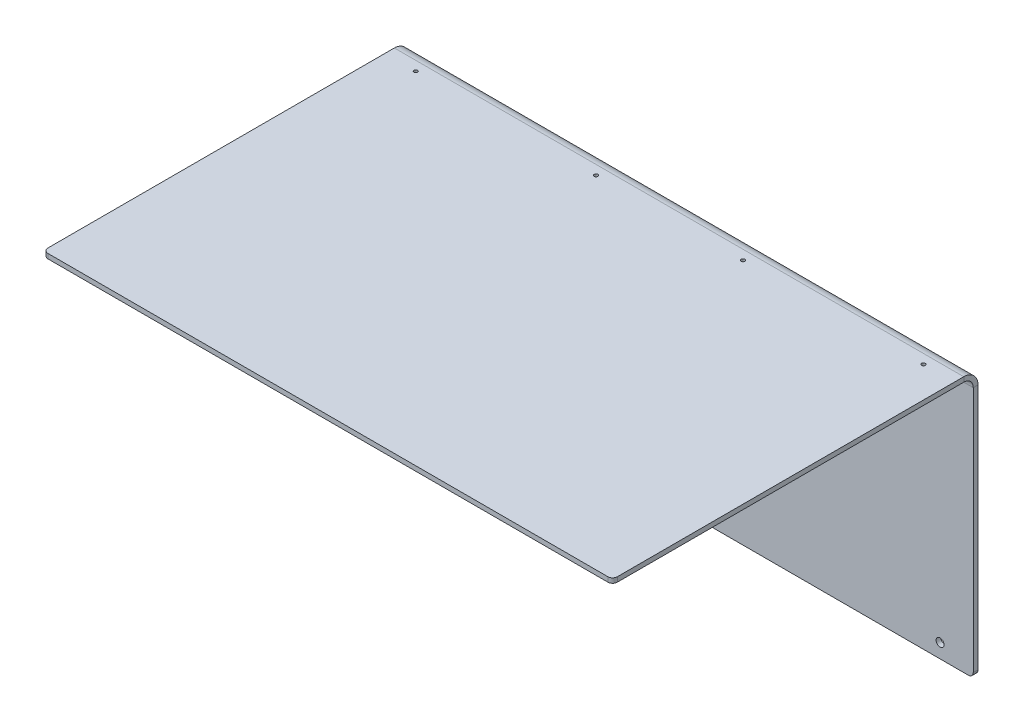
ISO-10303-21;
HEADER;
FILE_DESCRIPTION(('STEP AP214'),'2;1');
FILE_NAME('part.step','',(''),(''),'','','');
FILE_SCHEMA(('AUTOMOTIVE_DESIGN { 1 0 10303 214 1 1 1 1 }'));
ENDSEC;
DATA;
#1=APPLICATION_CONTEXT('core data for automotive mechanical design processes');
#2=APPLICATION_PROTOCOL_DEFINITION('international standard','automotive_design',2000,#1);
#3=PRODUCT_CONTEXT('',#1,'mechanical');
#4=PRODUCT('Part','Part','',(#3));
#5=PRODUCT_RELATED_PRODUCT_CATEGORY('part','',(#4));
#6=PRODUCT_DEFINITION_FORMATION('','',#4);
#7=PRODUCT_DEFINITION_CONTEXT('part definition',#1,'design');
#8=PRODUCT_DEFINITION('design','',#6,#7);
#9=PRODUCT_DEFINITION_SHAPE('','',#8);
#10=(LENGTH_UNIT() NAMED_UNIT(*) SI_UNIT(.MILLI.,.METRE.));
#11=(NAMED_UNIT(*) PLANE_ANGLE_UNIT() SI_UNIT($,.RADIAN.));
#12=(NAMED_UNIT(*) SI_UNIT($,.STERADIAN.) SOLID_ANGLE_UNIT());
#13=UNCERTAINTY_MEASURE_WITH_UNIT(LENGTH_MEASURE(1.E-05),#10,'distance_accuracy_value','');
#14=(GEOMETRIC_REPRESENTATION_CONTEXT(3) GLOBAL_UNCERTAINTY_ASSIGNED_CONTEXT((#13)) GLOBAL_UNIT_ASSIGNED_CONTEXT((#10,
#11,#12)) REPRESENTATION_CONTEXT('',''));
#15=CARTESIAN_POINT('',(0.,0.,0.));
#16=DIRECTION('',(0.,0.,1.));
#17=DIRECTION('',(1.,0.,0.));
#18=AXIS2_PLACEMENT_3D('',#15,#16,#17);
#19=CARTESIAN_POINT('',(-381.,-174.625,3.175));
#20=DIRECTION('',(1.,0.,0.));
#21=DIRECTION('',(0.,-1.,0.));
#22=AXIS2_PLACEMENT_3D('',#19,#20,#21);
#23=PLANE('',#22);
#24=DIRECTION('',(0.,1.,0.));
#25=VECTOR('',#24,1.);
#26=CARTESIAN_POINT('',(-381.,0.,-3.175));
#27=LINE('',#26,#25);
#28=CARTESIAN_POINT('',(-381.,161.925,-3.17499999999996));
#29=VERTEX_POINT('',#28);
#30=CARTESIAN_POINT('',(-381.,-168.275,-3.175));
#31=VERTEX_POINT('',#30);
#32=EDGE_CURVE('E203',#29,#31,#27,.F.);
#33=ORIENTED_EDGE('',*,*,#32,.T.);
#34=DIRECTION('',(0.,0.,-1.));
#35=VECTOR('',#34,1.);
#36=CARTESIAN_POINT('',(-381.,-168.275,3.175));
#37=LINE('',#36,#35);
#38=CARTESIAN_POINT('',(-381.,-168.275,3.175));
#39=VERTEX_POINT('',#38);
#40=EDGE_CURVE('E46',#31,#39,#37,.F.);
#41=ORIENTED_EDGE('',*,*,#40,.T.);
#42=DIRECTION('',(0.,-1.,0.));
#43=VECTOR('',#42,1.);
#44=CARTESIAN_POINT('',(-381.,-174.625,3.175));
#45=LINE('',#44,#43);
#46=CARTESIAN_POINT('',(-381.,161.925,3.17500000000004));
#47=VERTEX_POINT('',#46);
#48=EDGE_CURVE('E194',#47,#39,#45,.T.);
#49=ORIENTED_EDGE('',*,*,#48,.F.);
#50=DIRECTION('',(0.,0.,-1.));
#51=VECTOR('',#50,1.);
#52=CARTESIAN_POINT('',(-381.,161.925,3.17500000000004));
#53=LINE('',#52,#51);
#54=EDGE_CURVE('E179',#47,#29,#53,.T.);
#55=ORIENTED_EDGE('',*,*,#54,.T.);
#56=EDGE_LOOP('',(#33,#41,#49,#55));
#57=FACE_BOUND('',#56,.T.);
#58=ADVANCED_FACE('F38',(#57),#23,.F.);
#59=CARTESIAN_POINT('',(0.,0.,3.175));
#60=DIRECTION('',(0.,0.,-1.));
#61=DIRECTION('',(-1.,0.,0.));
#62=AXIS2_PLACEMENT_3D('',#59,#60,#61);
#63=PLANE('',#62);
#64=CARTESIAN_POINT('',(342.9,149.225,3.175));
#65=DIRECTION('',(0.,0.,-1.));
#66=DIRECTION('',(-1.,0.,0.));
#67=AXIS2_PLACEMENT_3D('',#64,#65,#66);
#68=CIRCLE('',#67,2.45744999999994);
#69=CARTESIAN_POINT('',(340.44255,149.225,3.175));
#70=VERTEX_POINT('',#69);
#71=EDGE_CURVE('E317',#70,#70,#68,.T.);
#72=ORIENTED_EDGE('',*,*,#71,.T.);
#73=EDGE_LOOP('',(#72));
#74=FACE_BOUND('',#73,.T.);
#75=CARTESIAN_POINT('',(114.3,149.225,3.175));
#76=DIRECTION('',(0.,0.,-1.));
#77=DIRECTION('',(-1.,0.,0.));
#78=AXIS2_PLACEMENT_3D('',#75,#76,#77);
#79=CIRCLE('',#78,2.45744999999997);
#80=CARTESIAN_POINT('',(111.84255,149.225,3.175));
#81=VERTEX_POINT('',#80);
#82=EDGE_CURVE('E311',#81,#81,#79,.T.);
#83=ORIENTED_EDGE('',*,*,#82,.T.);
#84=EDGE_LOOP('',(#83));
#85=FACE_BOUND('',#84,.T.);
#86=CARTESIAN_POINT('',(-114.3,149.225,3.175));
#87=DIRECTION('',(0.,0.,-1.));
#88=DIRECTION('',(-1.,0.,0.));
#89=AXIS2_PLACEMENT_3D('',#86,#87,#88);
#90=CIRCLE('',#89,2.45744999999997);
#91=CARTESIAN_POINT('',(-116.75745,149.225,3.175));
#92=VERTEX_POINT('',#91);
#93=EDGE_CURVE('E305',#92,#92,#90,.T.);
#94=ORIENTED_EDGE('',*,*,#93,.T.);
#95=EDGE_LOOP('',(#94));
#96=FACE_BOUND('',#95,.T.);
#97=CARTESIAN_POINT('',(-342.9,149.225,3.175));
#98=DIRECTION('',(0.,0.,-1.));
#99=DIRECTION('',(-1.,0.,0.));
#100=AXIS2_PLACEMENT_3D('',#97,#98,#99);
#101=CIRCLE('',#100,2.45744999999994);
#102=CARTESIAN_POINT('',(-345.35745,149.225,3.175));
#103=VERTEX_POINT('',#102);
#104=EDGE_CURVE('E299',#103,#103,#101,.T.);
#105=ORIENTED_EDGE('',*,*,#104,.T.);
#106=EDGE_LOOP('',(#105));
#107=FACE_BOUND('',#106,.T.);
#108=CARTESIAN_POINT('',(31.75,-155.575,3.175));
#109=DIRECTION('',(0.,0.,-1.));
#110=DIRECTION('',(-1.,0.,0.));
#111=AXIS2_PLACEMENT_3D('',#108,#109,#110);
#112=CIRCLE('',#111,5.35787599999991);
#113=CARTESIAN_POINT('',(26.3921240000001,-155.575,3.175));
#114=VERTEX_POINT('',#113);
#115=EDGE_CURVE('E293',#114,#114,#112,.T.);
#116=ORIENTED_EDGE('',*,*,#115,.T.);
#117=EDGE_LOOP('',(#116));
#118=FACE_BOUND('',#117,.T.);
#119=CARTESIAN_POINT('',(-336.55,-155.575,3.175));
#120=DIRECTION('',(0.,0.,-1.));
#121=DIRECTION('',(-1.,0.,0.));
#122=AXIS2_PLACEMENT_3D('',#119,#120,#121);
#123=CIRCLE('',#122,5.3578759999999);
#124=CARTESIAN_POINT('',(-341.907876,-155.575,3.175));
#125=VERTEX_POINT('',#124);
#126=EDGE_CURVE('E287',#125,#125,#123,.T.);
#127=ORIENTED_EDGE('',*,*,#126,.T.);
#128=EDGE_LOOP('',(#127));
#129=FACE_BOUND('',#128,.T.);
#130=CARTESIAN_POINT('',(-31.75,-155.575,3.175));
#131=DIRECTION('',(0.,0.,-1.));
#132=DIRECTION('',(-1.,0.,0.));
#133=AXIS2_PLACEMENT_3D('',#130,#131,#132);
#134=CIRCLE('',#133,5.35787599999991);
#135=CARTESIAN_POINT('',(-37.1078759999999,-155.575,3.175));
#136=VERTEX_POINT('',#135);
#137=EDGE_CURVE('E281',#136,#136,#134,.T.);
#138=ORIENTED_EDGE('',*,*,#137,.T.);
#139=EDGE_LOOP('',(#138));
#140=FACE_BOUND('',#139,.T.);
#141=CARTESIAN_POINT('',(336.55,-155.575,3.175));
#142=DIRECTION('',(0.,0.,-1.));
#143=DIRECTION('',(-1.,0.,0.));
#144=AXIS2_PLACEMENT_3D('',#141,#142,#143);
#145=CIRCLE('',#144,5.3578759999999);
#146=CARTESIAN_POINT('',(331.192124,-155.575,3.175));
#147=VERTEX_POINT('',#146);
#148=EDGE_CURVE('E272',#147,#147,#145,.T.);
#149=ORIENTED_EDGE('',*,*,#148,.T.);
#150=EDGE_LOOP('',(#149));
#151=FACE_BOUND('',#150,.T.);
#152=DIRECTION('',(1.,0.,0.));
#153=VECTOR('',#152,1.);
#154=CARTESIAN_POINT('',(-381.,-174.625,3.175));
#155=LINE('',#154,#153);
#156=CARTESIAN_POINT('',(-374.65,-174.625,3.175));
#157=VERTEX_POINT('',#156);
#158=CARTESIAN_POINT('',(374.65,-174.625,3.175));
#159=VERTEX_POINT('',#158);
#160=EDGE_CURVE('E198',#157,#159,#155,.T.);
#161=ORIENTED_EDGE('',*,*,#160,.T.);
#162=CARTESIAN_POINT('',(374.65,-168.275,3.175));
#163=DIRECTION('',(0.,0.,-1.));
#164=DIRECTION('',(-1.,0.,0.));
#165=AXIS2_PLACEMENT_3D('',#162,#163,#164);
#166=CIRCLE('',#165,6.35);
#167=CARTESIAN_POINT('',(381.,-168.275,3.175));
#168=VERTEX_POINT('',#167);
#169=EDGE_CURVE('E242',#159,#168,#166,.F.);
#170=ORIENTED_EDGE('',*,*,#169,.T.);
#171=DIRECTION('',(0.,1.,0.));
#172=VECTOR('',#171,1.);
#173=CARTESIAN_POINT('',(381.,-174.625,3.175));
#174=LINE('',#173,#172);
#175=CARTESIAN_POINT('',(381.,161.925,3.17500000000004));
#176=VERTEX_POINT('',#175);
#177=EDGE_CURVE('E192',#168,#176,#174,.T.);
#178=ORIENTED_EDGE('',*,*,#177,.T.);
#179=DIRECTION('',(-1.,0.,0.));
#180=VECTOR('',#179,1.);
#181=CARTESIAN_POINT('',(-381.,161.925,3.17500000000004));
#182=LINE('',#181,#180);
#183=EDGE_CURVE('E183',#47,#176,#182,.F.);
#184=ORIENTED_EDGE('',*,*,#183,.F.);
#185=ORIENTED_EDGE('',*,*,#48,.T.);
#186=CARTESIAN_POINT('',(-374.65,-168.275,3.175));
#187=DIRECTION('',(0.,0.,-1.));
#188=DIRECTION('',(-1.,0.,0.));
#189=AXIS2_PLACEMENT_3D('',#186,#187,#188);
#190=CIRCLE('',#189,6.35);
#191=EDGE_CURVE('E240',#39,#157,#190,.F.);
#192=ORIENTED_EDGE('',*,*,#191,.T.);
#193=EDGE_LOOP('',(#161,#170,#178,#184,#185,#192));
#194=FACE_BOUND('',#193,.T.);
#195=ADVANCED_FACE('F254',(#74,#85,#96,#107,#118,#129,#140,#151,#194),#63,.F.);
#196=CARTESIAN_POINT('',(0.,0.,-3.175));
#197=DIRECTION('',(0.,0.,-1.));
#198=DIRECTION('',(-1.,0.,0.));
#199=AXIS2_PLACEMENT_3D('',#196,#197,#198);
#200=PLANE('',#199);
#201=CARTESIAN_POINT('',(342.9,149.225,-3.175));
#202=DIRECTION('',(0.,0.,-1.));
#203=DIRECTION('',(-1.,0.,0.));
#204=AXIS2_PLACEMENT_3D('',#201,#202,#203);
#205=CIRCLE('',#204,2.45744999999997);
#206=CARTESIAN_POINT('',(340.44255,149.225,-3.175));
#207=VERTEX_POINT('',#206);
#208=EDGE_CURVE('E320',#207,#207,#205,.T.);
#209=ORIENTED_EDGE('',*,*,#208,.F.);
#210=EDGE_LOOP('',(#209));
#211=FACE_BOUND('',#210,.T.);
#212=CARTESIAN_POINT('',(114.3,149.225,-3.175));
#213=DIRECTION('',(0.,0.,-1.));
#214=DIRECTION('',(-1.,0.,0.));
#215=AXIS2_PLACEMENT_3D('',#212,#213,#214);
#216=CIRCLE('',#215,2.45744999999999);
#217=CARTESIAN_POINT('',(111.84255,149.225,-3.175));
#218=VERTEX_POINT('',#217);
#219=EDGE_CURVE('E314',#218,#218,#216,.T.);
#220=ORIENTED_EDGE('',*,*,#219,.F.);
#221=EDGE_LOOP('',(#220));
#222=FACE_BOUND('',#221,.T.);
#223=CARTESIAN_POINT('',(-114.3,149.225,-3.175));
#224=DIRECTION('',(0.,0.,-1.));
#225=DIRECTION('',(-1.,0.,0.));
#226=AXIS2_PLACEMENT_3D('',#223,#224,#225);
#227=CIRCLE('',#226,2.45744999999999);
#228=CARTESIAN_POINT('',(-116.75745,149.225,-3.175));
#229=VERTEX_POINT('',#228);
#230=EDGE_CURVE('E308',#229,#229,#227,.T.);
#231=ORIENTED_EDGE('',*,*,#230,.F.);
#232=EDGE_LOOP('',(#231));
#233=FACE_BOUND('',#232,.T.);
#234=CARTESIAN_POINT('',(-342.9,149.225,-3.175));
#235=DIRECTION('',(0.,0.,-1.));
#236=DIRECTION('',(-1.,0.,0.));
#237=AXIS2_PLACEMENT_3D('',#234,#235,#236);
#238=CIRCLE('',#237,2.45744999999997);
#239=CARTESIAN_POINT('',(-345.35745,149.225,-3.175));
#240=VERTEX_POINT('',#239);
#241=EDGE_CURVE('E302',#240,#240,#238,.T.);
#242=ORIENTED_EDGE('',*,*,#241,.F.);
#243=EDGE_LOOP('',(#242));
#244=FACE_BOUND('',#243,.T.);
#245=CARTESIAN_POINT('',(31.75,-155.575,-3.175));
#246=DIRECTION('',(0.,0.,-1.));
#247=DIRECTION('',(-1.,0.,0.));
#248=AXIS2_PLACEMENT_3D('',#245,#246,#247);
#249=CIRCLE('',#248,5.35787599999994);
#250=CARTESIAN_POINT('',(26.3921240000001,-155.575,-3.175));
#251=VERTEX_POINT('',#250);
#252=EDGE_CURVE('E296',#251,#251,#249,.T.);
#253=ORIENTED_EDGE('',*,*,#252,.F.);
#254=EDGE_LOOP('',(#253));
#255=FACE_BOUND('',#254,.T.);
#256=CARTESIAN_POINT('',(-336.55,-155.575,-3.175));
#257=DIRECTION('',(0.,0.,-1.));
#258=DIRECTION('',(-1.,0.,0.));
#259=AXIS2_PLACEMENT_3D('',#256,#257,#258);
#260=CIRCLE('',#259,5.35787599999993);
#261=CARTESIAN_POINT('',(-341.907876,-155.575,-3.175));
#262=VERTEX_POINT('',#261);
#263=EDGE_CURVE('E290',#262,#262,#260,.T.);
#264=ORIENTED_EDGE('',*,*,#263,.F.);
#265=EDGE_LOOP('',(#264));
#266=FACE_BOUND('',#265,.T.);
#267=CARTESIAN_POINT('',(-31.75,-155.575,-3.175));
#268=DIRECTION('',(0.,0.,-1.));
#269=DIRECTION('',(-1.,0.,0.));
#270=AXIS2_PLACEMENT_3D('',#267,#268,#269);
#271=CIRCLE('',#270,5.35787599999994);
#272=CARTESIAN_POINT('',(-37.1078759999999,-155.575,-3.175));
#273=VERTEX_POINT('',#272);
#274=EDGE_CURVE('E284',#273,#273,#271,.T.);
#275=ORIENTED_EDGE('',*,*,#274,.F.);
#276=EDGE_LOOP('',(#275));
#277=FACE_BOUND('',#276,.T.);
#278=CARTESIAN_POINT('',(336.55,-155.575,-3.175));
#279=DIRECTION('',(0.,0.,-1.));
#280=DIRECTION('',(-1.,0.,0.));
#281=AXIS2_PLACEMENT_3D('',#278,#279,#280);
#282=CIRCLE('',#281,5.35787599999993);
#283=CARTESIAN_POINT('',(331.192124,-155.575,-3.175));
#284=VERTEX_POINT('',#283);
#285=EDGE_CURVE('E276',#284,#284,#282,.T.);
#286=ORIENTED_EDGE('',*,*,#285,.F.);
#287=EDGE_LOOP('',(#286));
#288=FACE_BOUND('',#287,.T.);
#289=DIRECTION('',(0.,1.,0.));
#290=VECTOR('',#289,1.);
#291=CARTESIAN_POINT('',(381.,0.,-3.175));
#292=LINE('',#291,#290);
#293=CARTESIAN_POINT('',(381.,-168.275,-3.175));
#294=VERTEX_POINT('',#293);
#295=CARTESIAN_POINT('',(381.,161.925,-3.175));
#296=VERTEX_POINT('',#295);
#297=EDGE_CURVE('E190',#294,#296,#292,.T.);
#298=ORIENTED_EDGE('',*,*,#297,.F.);
#299=CARTESIAN_POINT('',(374.65,-168.275,-3.175));
#300=DIRECTION('',(0.,0.,-1.));
#301=DIRECTION('',(-1.,0.,0.));
#302=AXIS2_PLACEMENT_3D('',#299,#300,#301);
#303=CIRCLE('',#302,6.35);
#304=CARTESIAN_POINT('',(374.65,-174.625,-3.175));
#305=VERTEX_POINT('',#304);
#306=EDGE_CURVE('E246',#294,#305,#303,.T.);
#307=ORIENTED_EDGE('',*,*,#306,.T.);
#308=DIRECTION('',(-1.,0.,0.));
#309=VECTOR('',#308,1.);
#310=CARTESIAN_POINT('',(0.,-174.625,-3.175));
#311=LINE('',#310,#309);
#312=CARTESIAN_POINT('',(-374.65,-174.625,-3.175));
#313=VERTEX_POINT('',#312);
#314=EDGE_CURVE('E195',#313,#305,#311,.F.);
#315=ORIENTED_EDGE('',*,*,#314,.F.);
#316=CARTESIAN_POINT('',(-374.65,-168.275,-3.175));
#317=DIRECTION('',(0.,0.,-1.));
#318=DIRECTION('',(-1.,0.,0.));
#319=AXIS2_PLACEMENT_3D('',#316,#317,#318);
#320=CIRCLE('',#319,6.35);
#321=EDGE_CURVE('E53',#313,#31,#320,.T.);
#322=ORIENTED_EDGE('',*,*,#321,.T.);
#323=ORIENTED_EDGE('',*,*,#32,.F.);
#324=DIRECTION('',(-1.,0.,0.));
#325=VECTOR('',#324,1.);
#326=CARTESIAN_POINT('',(-381.,161.925,-3.17499999999996));
#327=LINE('',#326,#325);
#328=EDGE_CURVE('E137',#29,#296,#327,.F.);
#329=ORIENTED_EDGE('',*,*,#328,.T.);
#330=EDGE_LOOP('',(#298,#307,#315,#322,#323,#329));
#331=FACE_BOUND('',#330,.T.);
#332=ADVANCED_FACE('F368',(#211,#222,#233,#244,#255,#266,#277,#288,#331),#200,.T.);
#333=CARTESIAN_POINT('',(-381.,-174.625,3.175));
#334=DIRECTION('',(0.,1.,0.));
#335=DIRECTION('',(1.,0.,0.));
#336=AXIS2_PLACEMENT_3D('',#333,#334,#335);
#337=PLANE('',#336);
#338=ORIENTED_EDGE('',*,*,#314,.T.);
#339=DIRECTION('',(0.,0.,-1.));
#340=VECTOR('',#339,1.);
#341=CARTESIAN_POINT('',(374.65,-174.625,3.175));
#342=LINE('',#341,#340);
#343=EDGE_CURVE('E237',#305,#159,#342,.F.);
#344=ORIENTED_EDGE('',*,*,#343,.T.);
#345=ORIENTED_EDGE('',*,*,#160,.F.);
#346=DIRECTION('',(0.,0.,-1.));
#347=VECTOR('',#346,1.);
#348=CARTESIAN_POINT('',(-374.65,-174.625,3.175));
#349=LINE('',#348,#347);
#350=EDGE_CURVE('E235',#157,#313,#349,.T.);
#351=ORIENTED_EDGE('',*,*,#350,.T.);
#352=EDGE_LOOP('',(#338,#344,#345,#351));
#353=FACE_BOUND('',#352,.T.);
#354=ADVANCED_FACE('F373',(#353),#337,.F.);
#355=CARTESIAN_POINT('',(381.,-174.625,3.175));
#356=DIRECTION('',(-1.,0.,0.));
#357=DIRECTION('',(0.,1.,0.));
#358=AXIS2_PLACEMENT_3D('',#355,#356,#357);
#359=PLANE('',#358);
#360=ORIENTED_EDGE('',*,*,#177,.F.);
#361=DIRECTION('',(0.,0.,-1.));
#362=VECTOR('',#361,1.);
#363=CARTESIAN_POINT('',(381.,-168.275,3.175));
#364=LINE('',#363,#362);
#365=EDGE_CURVE('E61',#168,#294,#364,.T.);
#366=ORIENTED_EDGE('',*,*,#365,.T.);
#367=ORIENTED_EDGE('',*,*,#297,.T.);
#368=DIRECTION('',(0.,0.,-1.));
#369=VECTOR('',#368,1.);
#370=CARTESIAN_POINT('',(381.,161.925,3.17500000000004));
#371=LINE('',#370,#369);
#372=EDGE_CURVE('E187',#176,#296,#371,.T.);
#373=ORIENTED_EDGE('',*,*,#372,.F.);
#374=EDGE_LOOP('',(#360,#366,#367,#373));
#375=FACE_BOUND('',#374,.T.);
#376=ADVANCED_FACE('F266',(#375),#359,.F.);
#377=CARTESIAN_POINT('',(381.,161.925,15.875));
#378=DIRECTION('',(1.,0.,0.));
#379=DIRECTION('',(0.,0.,-1.));
#380=AXIS2_PLACEMENT_3D('',#377,#378,#379);
#381=PLANE('',#380);
#382=DIRECTION('',(0.,1.,0.));
#383=VECTOR('',#382,1.);
#384=CARTESIAN_POINT('',(381.,174.625,15.875));
#385=LINE('',#384,#383);
#386=CARTESIAN_POINT('',(381.,174.625,15.875));
#387=VERTEX_POINT('',#386);
#388=CARTESIAN_POINT('',(381.,180.975,15.875));
#389=VERTEX_POINT('',#388);
#390=EDGE_CURVE('E265',#387,#389,#385,.T.);
#391=ORIENTED_EDGE('',*,*,#390,.F.);
#392=CARTESIAN_POINT('',(381.,161.925,15.875));
#393=DIRECTION('',(-1.,0.,0.));
#394=DIRECTION('',(0.,0.,1.));
#395=AXIS2_PLACEMENT_3D('',#392,#393,#394);
#396=CIRCLE('',#395,12.7);
#397=EDGE_CURVE('E140',#176,#387,#396,.F.);
#398=ORIENTED_EDGE('',*,*,#397,.F.);
#399=ORIENTED_EDGE('',*,*,#372,.T.);
#400=CARTESIAN_POINT('',(381.,161.925,15.875));
#401=DIRECTION('',(-1.,0.,0.));
#402=DIRECTION('',(0.,0.,1.));
#403=AXIS2_PLACEMENT_3D('',#400,#401,#402);
#404=CIRCLE('',#403,19.05);
#405=EDGE_CURVE('E178',#296,#389,#404,.F.);
#406=ORIENTED_EDGE('',*,*,#405,.T.);
#407=EDGE_LOOP('',(#391,#398,#399,#406));
#408=FACE_BOUND('',#407,.T.);
#409=ADVANCED_FACE('F263',(#408),#381,.T.);
#410=CARTESIAN_POINT('',(-381.,161.925,15.875));
#411=DIRECTION('',(1.,0.,0.));
#412=DIRECTION('',(0.,0.,-1.));
#413=AXIS2_PLACEMENT_3D('',#410,#411,#412);
#414=PLANE('',#413);
#415=CARTESIAN_POINT('',(-381.,161.925,15.875));
#416=DIRECTION('',(-1.,0.,0.));
#417=DIRECTION('',(0.,0.,1.));
#418=AXIS2_PLACEMENT_3D('',#415,#416,#417);
#419=CIRCLE('',#418,12.7);
#420=CARTESIAN_POINT('',(-381.,174.625,15.875));
#421=VERTEX_POINT('',#420);
#422=EDGE_CURVE('E147',#421,#47,#419,.T.);
#423=ORIENTED_EDGE('',*,*,#422,.F.);
#424=DIRECTION('',(0.,1.,0.));
#425=VECTOR('',#424,1.);
#426=CARTESIAN_POINT('',(-381.,174.625,15.875));
#427=LINE('',#426,#425);
#428=CARTESIAN_POINT('',(-381.,180.975,15.875));
#429=VERTEX_POINT('',#428);
#430=EDGE_CURVE('E144',#421,#429,#427,.T.);
#431=ORIENTED_EDGE('',*,*,#430,.T.);
#432=CARTESIAN_POINT('',(-381.,161.925,15.875));
#433=DIRECTION('',(-1.,0.,0.));
#434=DIRECTION('',(0.,0.,1.));
#435=AXIS2_PLACEMENT_3D('',#432,#433,#434);
#436=CIRCLE('',#435,19.05);
#437=EDGE_CURVE('E129',#429,#29,#436,.T.);
#438=ORIENTED_EDGE('',*,*,#437,.T.);
#439=ORIENTED_EDGE('',*,*,#54,.F.);
#440=EDGE_LOOP('',(#423,#431,#438,#439));
#441=FACE_BOUND('',#440,.T.);
#442=ADVANCED_FACE('F145',(#441),#414,.F.);
#443=CARTESIAN_POINT('',(-381.,161.925,15.875));
#444=DIRECTION('',(-1.,0.,0.));
#445=DIRECTION('',(0.,1.,0.));
#446=AXIS2_PLACEMENT_3D('',#443,#444,#445);
#447=CYLINDRICAL_SURFACE('',#446,19.05);
#448=ORIENTED_EDGE('',*,*,#328,.F.);
#449=ORIENTED_EDGE('',*,*,#437,.F.);
#450=DIRECTION('',(1.,0.,0.));
#451=VECTOR('',#450,1.);
#452=CARTESIAN_POINT('',(0.,180.975,15.875));
#453=LINE('',#452,#451);
#454=EDGE_CURVE('E134',#429,#389,#453,.T.);
#455=ORIENTED_EDGE('',*,*,#454,.T.);
#456=ORIENTED_EDGE('',*,*,#405,.F.);
#457=EDGE_LOOP('',(#448,#449,#455,#456));
#458=FACE_BOUND('',#457,.T.);
#459=ADVANCED_FACE('F131',(#458),#447,.T.);
#460=CARTESIAN_POINT('',(-381.,161.925,15.875));
#461=DIRECTION('',(-1.,0.,0.));
#462=DIRECTION('',(0.,1.,0.));
#463=AXIS2_PLACEMENT_3D('',#460,#461,#462);
#464=CYLINDRICAL_SURFACE('',#463,12.7);
#465=ORIENTED_EDGE('',*,*,#183,.T.);
#466=ORIENTED_EDGE('',*,*,#397,.T.);
#467=DIRECTION('',(-1.,0.,0.));
#468=VECTOR('',#467,1.);
#469=CARTESIAN_POINT('',(381.,174.625,15.875));
#470=LINE('',#469,#468);
#471=EDGE_CURVE('E152',#387,#421,#470,.T.);
#472=ORIENTED_EDGE('',*,*,#471,.T.);
#473=ORIENTED_EDGE('',*,*,#422,.T.);
#474=EDGE_LOOP('',(#465,#466,#472,#473));
#475=FACE_BOUND('',#474,.T.);
#476=ADVANCED_FACE('F258',(#475),#464,.F.);
#477=CARTESIAN_POINT('',(381.,180.975,3.17499999999998));
#478=DIRECTION('',(-1.,0.,0.));
#479=DIRECTION('',(0.,0.,1.));
#480=AXIS2_PLACEMENT_3D('',#477,#478,#479);
#481=PLANE('',#480);
#482=DIRECTION('',(0.,0.,-1.));
#483=VECTOR('',#482,1.);
#484=CARTESIAN_POINT('',(381.,180.975,3.17499999999998));
#485=LINE('',#484,#483);
#486=CARTESIAN_POINT('',(381.,180.975000000002,479.424999999998));
#487=VERTEX_POINT('',#486);
#488=EDGE_CURVE('E161',#487,#389,#485,.T.);
#489=ORIENTED_EDGE('',*,*,#488,.F.);
#490=DIRECTION('',(0.,-1.,0.));
#491=VECTOR('',#490,1.);
#492=CARTESIAN_POINT('',(381.,180.975000000002,479.424999999998));
#493=LINE('',#492,#491);
#494=CARTESIAN_POINT('',(381.,174.625000000002,479.424999999998));
#495=VERTEX_POINT('',#494);
#496=EDGE_CURVE('E201',#487,#495,#493,.T.);
#497=ORIENTED_EDGE('',*,*,#496,.T.);
#498=DIRECTION('',(0.,0.,-1.));
#499=VECTOR('',#498,1.);
#500=CARTESIAN_POINT('',(381.,174.625,3.175));
#501=LINE('',#500,#499);
#502=EDGE_CURVE('E162',#495,#387,#501,.T.);
#503=ORIENTED_EDGE('',*,*,#502,.T.);
#504=ORIENTED_EDGE('',*,*,#390,.T.);
#505=EDGE_LOOP('',(#489,#497,#503,#504));
#506=FACE_BOUND('',#505,.T.);
#507=ADVANCED_FACE('F269',(#506),#481,.F.);
#508=CARTESIAN_POINT('',(-381.,180.975000000002,485.774999999998));
#509=DIRECTION('',(1.,0.,0.));
#510=DIRECTION('',(0.,0.,-1.));
#511=AXIS2_PLACEMENT_3D('',#508,#509,#510);
#512=PLANE('',#511);
#513=DIRECTION('',(0.,0.,1.));
#514=VECTOR('',#513,1.);
#515=CARTESIAN_POINT('',(-381.,174.625000000002,485.774999999998));
#516=LINE('',#515,#514);
#517=CARTESIAN_POINT('',(-381.,174.625000000002,479.424999999998));
#518=VERTEX_POINT('',#517);
#519=EDGE_CURVE('E173',#421,#518,#516,.T.);
#520=ORIENTED_EDGE('',*,*,#519,.T.);
#521=DIRECTION('',(0.,-1.,0.));
#522=VECTOR('',#521,1.);
#523=CARTESIAN_POINT('',(-381.,180.975000000002,479.424999999998));
#524=LINE('',#523,#522);
#525=CARTESIAN_POINT('',(-381.,180.975000000002,479.424999999998));
#526=VERTEX_POINT('',#525);
#527=EDGE_CURVE('E11',#518,#526,#524,.F.);
#528=ORIENTED_EDGE('',*,*,#527,.T.);
#529=DIRECTION('',(0.,0.,1.));
#530=VECTOR('',#529,1.);
#531=CARTESIAN_POINT('',(-381.,180.975000000002,485.774999999998));
#532=LINE('',#531,#530);
#533=EDGE_CURVE('E158',#429,#526,#532,.T.);
#534=ORIENTED_EDGE('',*,*,#533,.F.);
#535=ORIENTED_EDGE('',*,*,#430,.F.);
#536=EDGE_LOOP('',(#520,#528,#534,#535));
#537=FACE_BOUND('',#536,.T.);
#538=ADVANCED_FACE('F164',(#537),#512,.F.);
#539=CARTESIAN_POINT('',(0.,180.975,-6.34802197228203E-13));
#540=DIRECTION('',(0.,-1.,0.));
#541=DIRECTION('',(0.,0.,-1.));
#542=AXIS2_PLACEMENT_3D('',#539,#540,#541);
#543=PLANE('',#542);
#544=CARTESIAN_POINT('',(-339.725,180.975,28.5750000000001));
#545=DIRECTION('',(0.,1.,0.));
#546=DIRECTION('',(0.,0.,1.));
#547=AXIS2_PLACEMENT_3D('',#544,#545,#546);
#548=CIRCLE('',#547,2.45744999999997);
#549=CARTESIAN_POINT('',(-339.725,180.975,31.03245));
#550=VERTEX_POINT('',#549);
#551=EDGE_CURVE('E219',#550,#550,#548,.T.);
#552=ORIENTED_EDGE('',*,*,#551,.F.);
#553=EDGE_LOOP('',(#552));
#554=FACE_BOUND('',#553,.T.);
#555=CARTESIAN_POINT('',(-98.4250000000001,180.975,28.5749999999999));
#556=DIRECTION('',(0.,1.,0.));
#557=DIRECTION('',(0.,0.,1.));
#558=AXIS2_PLACEMENT_3D('',#555,#556,#557);
#559=CIRCLE('',#558,2.45744999999999);
#560=CARTESIAN_POINT('',(-98.4250000000001,180.975,31.0324499999998));
#561=VERTEX_POINT('',#560);
#562=EDGE_CURVE('E215',#561,#561,#559,.T.);
#563=ORIENTED_EDGE('',*,*,#562,.F.);
#564=EDGE_LOOP('',(#563));
#565=FACE_BOUND('',#564,.T.);
#566=CARTESIAN_POINT('',(98.4250000000001,180.975,28.5749999999999));
#567=DIRECTION('',(0.,1.,0.));
#568=DIRECTION('',(0.,0.,1.));
#569=AXIS2_PLACEMENT_3D('',#566,#567,#568);
#570=CIRCLE('',#569,2.45744999999999);
#571=CARTESIAN_POINT('',(98.4250000000001,180.975,31.0324499999998));
#572=VERTEX_POINT('',#571);
#573=EDGE_CURVE('E211',#572,#572,#570,.T.);
#574=ORIENTED_EDGE('',*,*,#573,.F.);
#575=EDGE_LOOP('',(#574));
#576=FACE_BOUND('',#575,.T.);
#577=CARTESIAN_POINT('',(339.725,180.975,28.5749999999999));
#578=DIRECTION('',(0.,1.,0.));
#579=DIRECTION('',(0.,0.,1.));
#580=AXIS2_PLACEMENT_3D('',#577,#578,#579);
#581=CIRCLE('',#580,2.45744999999997);
#582=CARTESIAN_POINT('',(339.725,180.975,31.0324499999999));
#583=VERTEX_POINT('',#582);
#584=EDGE_CURVE('E210',#583,#583,#581,.T.);
#585=ORIENTED_EDGE('',*,*,#584,.F.);
#586=EDGE_LOOP('',(#585));
#587=FACE_BOUND('',#586,.T.);
#588=DIRECTION('',(1.,0.,0.));
#589=VECTOR('',#588,1.);
#590=CARTESIAN_POINT('',(381.,180.975000000002,485.774999999998));
#591=LINE('',#590,#589);
#592=CARTESIAN_POINT('',(-374.65,180.975000000002,485.774999999998));
#593=VERTEX_POINT('',#592);
#594=CARTESIAN_POINT('',(374.65,180.975000000002,485.774999999998));
#595=VERTEX_POINT('',#594);
#596=EDGE_CURVE('E166',#593,#595,#591,.T.);
#597=ORIENTED_EDGE('',*,*,#596,.T.);
#598=CARTESIAN_POINT('',(374.65,180.975000000002,479.424999999998));
#599=DIRECTION('',(0.,-1.,0.));
#600=DIRECTION('',(0.,0.,-1.));
#601=AXIS2_PLACEMENT_3D('',#598,#599,#600);
#602=CIRCLE('',#601,6.35);
#603=EDGE_CURVE('E233',#595,#487,#602,.F.);
#604=ORIENTED_EDGE('',*,*,#603,.T.);
#605=ORIENTED_EDGE('',*,*,#488,.T.);
#606=ORIENTED_EDGE('',*,*,#454,.F.);
#607=ORIENTED_EDGE('',*,*,#533,.T.);
#608=CARTESIAN_POINT('',(-374.65,180.975000000002,479.424999999998));
#609=DIRECTION('',(0.,-1.,0.));
#610=DIRECTION('',(0.,0.,-1.));
#611=AXIS2_PLACEMENT_3D('',#608,#609,#610);
#612=CIRCLE('',#611,6.35);
#613=EDGE_CURVE('E231',#526,#593,#612,.F.);
#614=ORIENTED_EDGE('',*,*,#613,.T.);
#615=EDGE_LOOP('',(#597,#604,#605,#606,#607,#614));
#616=FACE_BOUND('',#615,.T.);
#617=ADVANCED_FACE('F157',(#554,#565,#576,#587,#616),#543,.F.);
#618=CARTESIAN_POINT('',(0.,174.625,-6.12631290726549E-13));
#619=DIRECTION('',(0.,-1.,0.));
#620=DIRECTION('',(0.,0.,-1.));
#621=AXIS2_PLACEMENT_3D('',#618,#619,#620);
#622=PLANE('',#621);
#623=CARTESIAN_POINT('',(-339.725,174.625,28.5750000000001));
#624=DIRECTION('',(0.,-1.,0.));
#625=DIRECTION('',(0.,0.,-1.));
#626=AXIS2_PLACEMENT_3D('',#623,#624,#625);
#627=CIRCLE('',#626,2.45744999999994);
#628=CARTESIAN_POINT('',(-339.725,174.625,26.1175500000001));
#629=VERTEX_POINT('',#628);
#630=EDGE_CURVE('E216',#629,#629,#627,.T.);
#631=ORIENTED_EDGE('',*,*,#630,.F.);
#632=EDGE_LOOP('',(#631));
#633=FACE_BOUND('',#632,.T.);
#634=CARTESIAN_POINT('',(-98.4250000000001,174.625,28.5749999999999));
#635=DIRECTION('',(0.,-1.,0.));
#636=DIRECTION('',(0.,0.,-1.));
#637=AXIS2_PLACEMENT_3D('',#634,#635,#636);
#638=CIRCLE('',#637,2.45744999999994);
#639=CARTESIAN_POINT('',(-98.4250000000001,174.625,26.1175499999999));
#640=VERTEX_POINT('',#639);
#641=EDGE_CURVE('E212',#640,#640,#638,.T.);
#642=ORIENTED_EDGE('',*,*,#641,.F.);
#643=EDGE_LOOP('',(#642));
#644=FACE_BOUND('',#643,.T.);
#645=CARTESIAN_POINT('',(98.4250000000001,174.625,28.5749999999999));
#646=DIRECTION('',(0.,-1.,0.));
#647=DIRECTION('',(0.,0.,-1.));
#648=AXIS2_PLACEMENT_3D('',#645,#646,#647);
#649=CIRCLE('',#648,2.45744999999994);
#650=CARTESIAN_POINT('',(98.4250000000001,174.625,26.1175499999999));
#651=VERTEX_POINT('',#650);
#652=EDGE_CURVE('E207',#651,#651,#649,.T.);
#653=ORIENTED_EDGE('',*,*,#652,.F.);
#654=EDGE_LOOP('',(#653));
#655=FACE_BOUND('',#654,.T.);
#656=CARTESIAN_POINT('',(339.725,174.625,28.5749999999999));
#657=DIRECTION('',(0.,-1.,0.));
#658=DIRECTION('',(0.,0.,-1.));
#659=AXIS2_PLACEMENT_3D('',#656,#657,#658);
#660=CIRCLE('',#659,2.45744999999994);
#661=CARTESIAN_POINT('',(339.725,174.625,26.11755));
#662=VERTEX_POINT('',#661);
#663=EDGE_CURVE('E323',#662,#662,#660,.T.);
#664=ORIENTED_EDGE('',*,*,#663,.F.);
#665=EDGE_LOOP('',(#664));
#666=FACE_BOUND('',#665,.T.);
#667=ORIENTED_EDGE('',*,*,#502,.F.);
#668=CARTESIAN_POINT('',(374.65,174.625000000002,479.424999999998));
#669=DIRECTION('',(0.,-1.,0.));
#670=DIRECTION('',(0.,0.,-1.));
#671=AXIS2_PLACEMENT_3D('',#668,#669,#670);
#672=CIRCLE('',#671,6.35);
#673=CARTESIAN_POINT('',(374.65,174.625000000002,485.774999999998));
#674=VERTEX_POINT('',#673);
#675=EDGE_CURVE('E224',#495,#674,#672,.T.);
#676=ORIENTED_EDGE('',*,*,#675,.T.);
#677=DIRECTION('',(1.,0.,0.));
#678=VECTOR('',#677,1.);
#679=CARTESIAN_POINT('',(381.,174.625000000002,485.774999999998));
#680=LINE('',#679,#678);
#681=CARTESIAN_POINT('',(-374.65,174.625000000002,485.774999999998));
#682=VERTEX_POINT('',#681);
#683=EDGE_CURVE('E169',#682,#674,#680,.T.);
#684=ORIENTED_EDGE('',*,*,#683,.F.);
#685=CARTESIAN_POINT('',(-374.65,174.625000000002,479.424999999998));
#686=DIRECTION('',(0.,-1.,0.));
#687=DIRECTION('',(0.,0.,-1.));
#688=AXIS2_PLACEMENT_3D('',#685,#686,#687);
#689=CIRCLE('',#688,6.35);
#690=EDGE_CURVE('E222',#682,#518,#689,.T.);
#691=ORIENTED_EDGE('',*,*,#690,.T.);
#692=ORIENTED_EDGE('',*,*,#519,.F.);
#693=ORIENTED_EDGE('',*,*,#471,.F.);
#694=EDGE_LOOP('',(#667,#676,#684,#691,#692,#693));
#695=FACE_BOUND('',#694,.T.);
#696=ADVANCED_FACE('F339',(#633,#644,#655,#666,#695),#622,.T.);
#697=CARTESIAN_POINT('',(381.,180.975000000002,485.774999999998));
#698=DIRECTION('',(0.,0.,-1.));
#699=DIRECTION('',(0.,1.,0.));
#700=AXIS2_PLACEMENT_3D('',#697,#698,#699);
#701=PLANE('',#700);
#702=ORIENTED_EDGE('',*,*,#683,.T.);
#703=DIRECTION('',(0.,-1.,0.));
#704=VECTOR('',#703,1.);
#705=CARTESIAN_POINT('',(374.65,180.975000000002,485.774999999998));
#706=LINE('',#705,#704);
#707=EDGE_CURVE('E229',#674,#595,#706,.F.);
#708=ORIENTED_EDGE('',*,*,#707,.T.);
#709=ORIENTED_EDGE('',*,*,#596,.F.);
#710=DIRECTION('',(0.,-1.,0.));
#711=VECTOR('',#710,1.);
#712=CARTESIAN_POINT('',(-374.65,180.975000000002,485.774999999998));
#713=LINE('',#712,#711);
#714=EDGE_CURVE('E226',#593,#682,#713,.T.);
#715=ORIENTED_EDGE('',*,*,#714,.T.);
#716=EDGE_LOOP('',(#702,#708,#709,#715));
#717=FACE_BOUND('',#716,.T.);
#718=ADVANCED_FACE('F417',(#717),#701,.F.);
#719=CARTESIAN_POINT('',(336.55,-155.575,-3.175));
#720=DIRECTION('',(0.,0.,-1.));
#721=DIRECTION('',(-1.,0.,0.));
#722=AXIS2_PLACEMENT_3D('',#719,#720,#721);
#723=CYLINDRICAL_SURFACE('',#722,5.3578759999999);
#724=ORIENTED_EDGE('',*,*,#285,.T.);
#725=EDGE_LOOP('',(#724));
#726=FACE_BOUND('',#725,.T.);
#727=ORIENTED_EDGE('',*,*,#148,.F.);
#728=EDGE_LOOP('',(#727));
#729=FACE_BOUND('',#728,.T.);
#730=ADVANCED_FACE('F420',(#726,#729),#723,.F.);
#731=CARTESIAN_POINT('',(-31.75,-155.575,-3.175));
#732=DIRECTION('',(0.,0.,-1.));
#733=DIRECTION('',(-1.,0.,0.));
#734=AXIS2_PLACEMENT_3D('',#731,#732,#733);
#735=CYLINDRICAL_SURFACE('',#734,5.35787599999991);
#736=ORIENTED_EDGE('',*,*,#274,.T.);
#737=EDGE_LOOP('',(#736));
#738=FACE_BOUND('',#737,.T.);
#739=ORIENTED_EDGE('',*,*,#137,.F.);
#740=EDGE_LOOP('',(#739));
#741=FACE_BOUND('',#740,.T.);
#742=ADVANCED_FACE('F427',(#738,#741),#735,.F.);
#743=CARTESIAN_POINT('',(-336.55,-155.575,-3.175));
#744=DIRECTION('',(0.,0.,-1.));
#745=DIRECTION('',(-1.,0.,0.));
#746=AXIS2_PLACEMENT_3D('',#743,#744,#745);
#747=CYLINDRICAL_SURFACE('',#746,5.3578759999999);
#748=ORIENTED_EDGE('',*,*,#263,.T.);
#749=EDGE_LOOP('',(#748));
#750=FACE_BOUND('',#749,.T.);
#751=ORIENTED_EDGE('',*,*,#126,.F.);
#752=EDGE_LOOP('',(#751));
#753=FACE_BOUND('',#752,.T.);
#754=ADVANCED_FACE('F431',(#750,#753),#747,.F.);
#755=CARTESIAN_POINT('',(31.75,-155.575,-3.175));
#756=DIRECTION('',(0.,0.,-1.));
#757=DIRECTION('',(-1.,0.,0.));
#758=AXIS2_PLACEMENT_3D('',#755,#756,#757);
#759=CYLINDRICAL_SURFACE('',#758,5.35787599999991);
#760=ORIENTED_EDGE('',*,*,#252,.T.);
#761=EDGE_LOOP('',(#760));
#762=FACE_BOUND('',#761,.T.);
#763=ORIENTED_EDGE('',*,*,#115,.F.);
#764=EDGE_LOOP('',(#763));
#765=FACE_BOUND('',#764,.T.);
#766=ADVANCED_FACE('F435',(#762,#765),#759,.F.);
#767=CARTESIAN_POINT('',(-342.9,149.225,-3.175));
#768=DIRECTION('',(0.,0.,-1.));
#769=DIRECTION('',(-1.,0.,0.));
#770=AXIS2_PLACEMENT_3D('',#767,#768,#769);
#771=CYLINDRICAL_SURFACE('',#770,2.45744999999994);
#772=ORIENTED_EDGE('',*,*,#241,.T.);
#773=EDGE_LOOP('',(#772));
#774=FACE_BOUND('',#773,.T.);
#775=ORIENTED_EDGE('',*,*,#104,.F.);
#776=EDGE_LOOP('',(#775));
#777=FACE_BOUND('',#776,.T.);
#778=ADVANCED_FACE('F439',(#774,#777),#771,.F.);
#779=CARTESIAN_POINT('',(-114.3,149.225,-3.175));
#780=DIRECTION('',(0.,0.,-1.));
#781=DIRECTION('',(-1.,0.,0.));
#782=AXIS2_PLACEMENT_3D('',#779,#780,#781);
#783=CYLINDRICAL_SURFACE('',#782,2.45744999999997);
#784=ORIENTED_EDGE('',*,*,#230,.T.);
#785=EDGE_LOOP('',(#784));
#786=FACE_BOUND('',#785,.T.);
#787=ORIENTED_EDGE('',*,*,#93,.F.);
#788=EDGE_LOOP('',(#787));
#789=FACE_BOUND('',#788,.T.);
#790=ADVANCED_FACE('F443',(#786,#789),#783,.F.);
#791=CARTESIAN_POINT('',(114.3,149.225,-3.175));
#792=DIRECTION('',(0.,0.,-1.));
#793=DIRECTION('',(-1.,0.,0.));
#794=AXIS2_PLACEMENT_3D('',#791,#792,#793);
#795=CYLINDRICAL_SURFACE('',#794,2.45744999999997);
#796=ORIENTED_EDGE('',*,*,#219,.T.);
#797=EDGE_LOOP('',(#796));
#798=FACE_BOUND('',#797,.T.);
#799=ORIENTED_EDGE('',*,*,#82,.F.);
#800=EDGE_LOOP('',(#799));
#801=FACE_BOUND('',#800,.T.);
#802=ADVANCED_FACE('F360',(#798,#801),#795,.F.);
#803=CARTESIAN_POINT('',(342.9,149.225,-3.175));
#804=DIRECTION('',(0.,0.,-1.));
#805=DIRECTION('',(-1.,0.,0.));
#806=AXIS2_PLACEMENT_3D('',#803,#804,#805);
#807=CYLINDRICAL_SURFACE('',#806,2.45744999999994);
#808=ORIENTED_EDGE('',*,*,#208,.T.);
#809=EDGE_LOOP('',(#808));
#810=FACE_BOUND('',#809,.T.);
#811=ORIENTED_EDGE('',*,*,#71,.F.);
#812=EDGE_LOOP('',(#811));
#813=FACE_BOUND('',#812,.T.);
#814=ADVANCED_FACE('F350',(#810,#813),#807,.F.);
#815=CARTESIAN_POINT('',(339.725,180.975,28.5749999999999));
#816=DIRECTION('',(0.,1.,0.));
#817=DIRECTION('',(0.,0.,1.));
#818=AXIS2_PLACEMENT_3D('',#815,#816,#817);
#819=CYLINDRICAL_SURFACE('',#818,2.45744999999994);
#820=ORIENTED_EDGE('',*,*,#663,.T.);
#821=EDGE_LOOP('',(#820));
#822=FACE_BOUND('',#821,.T.);
#823=ORIENTED_EDGE('',*,*,#584,.T.);
#824=EDGE_LOOP('',(#823));
#825=FACE_BOUND('',#824,.T.);
#826=ADVANCED_FACE('F347',(#822,#825),#819,.F.);
#827=CARTESIAN_POINT('',(98.4250000000001,180.975,28.5749999999999));
#828=DIRECTION('',(0.,1.,0.));
#829=DIRECTION('',(0.,0.,1.));
#830=AXIS2_PLACEMENT_3D('',#827,#828,#829);
#831=CYLINDRICAL_SURFACE('',#830,2.45744999999994);
#832=ORIENTED_EDGE('',*,*,#652,.T.);
#833=EDGE_LOOP('',(#832));
#834=FACE_BOUND('',#833,.T.);
#835=ORIENTED_EDGE('',*,*,#573,.T.);
#836=EDGE_LOOP('',(#835));
#837=FACE_BOUND('',#836,.T.);
#838=ADVANCED_FACE('F349',(#834,#837),#831,.F.);
#839=CARTESIAN_POINT('',(-98.4250000000001,180.975,28.5749999999999));
#840=DIRECTION('',(0.,1.,0.));
#841=DIRECTION('',(0.,0.,1.));
#842=AXIS2_PLACEMENT_3D('',#839,#840,#841);
#843=CYLINDRICAL_SURFACE('',#842,2.45744999999994);
#844=ORIENTED_EDGE('',*,*,#641,.T.);
#845=EDGE_LOOP('',(#844));
#846=FACE_BOUND('',#845,.T.);
#847=ORIENTED_EDGE('',*,*,#562,.T.);
#848=EDGE_LOOP('',(#847));
#849=FACE_BOUND('',#848,.T.);
#850=ADVANCED_FACE('F357',(#846,#849),#843,.F.);
#851=CARTESIAN_POINT('',(-339.725,180.975,28.5750000000001));
#852=DIRECTION('',(0.,1.,0.));
#853=DIRECTION('',(0.,0.,1.));
#854=AXIS2_PLACEMENT_3D('',#851,#852,#853);
#855=CYLINDRICAL_SURFACE('',#854,2.45744999999994);
#856=ORIENTED_EDGE('',*,*,#630,.T.);
#857=EDGE_LOOP('',(#856));
#858=FACE_BOUND('',#857,.T.);
#859=ORIENTED_EDGE('',*,*,#551,.T.);
#860=EDGE_LOOP('',(#859));
#861=FACE_BOUND('',#860,.T.);
#862=ADVANCED_FACE('F335',(#858,#861),#855,.F.);
#863=CARTESIAN_POINT('',(374.65,180.975000000002,479.424999999998));
#864=DIRECTION('',(0.,-1.,0.));
#865=DIRECTION('',(0.,0.,-1.));
#866=AXIS2_PLACEMENT_3D('',#863,#864,#865);
#867=CYLINDRICAL_SURFACE('',#866,6.35);
#868=ORIENTED_EDGE('',*,*,#603,.F.);
#869=ORIENTED_EDGE('',*,*,#707,.F.);
#870=ORIENTED_EDGE('',*,*,#675,.F.);
#871=ORIENTED_EDGE('',*,*,#496,.F.);
#872=EDGE_LOOP('',(#868,#869,#870,#871));
#873=FACE_BOUND('',#872,.T.);
#874=ADVANCED_FACE('F375',(#873),#867,.T.);
#875=CARTESIAN_POINT('',(374.65,-168.275,3.175));
#876=DIRECTION('',(0.,0.,1.));
#877=DIRECTION('',(1.,0.,0.));
#878=AXIS2_PLACEMENT_3D('',#875,#876,#877);
#879=CYLINDRICAL_SURFACE('',#878,6.35);
#880=ORIENTED_EDGE('',*,*,#306,.F.);
#881=ORIENTED_EDGE('',*,*,#365,.F.);
#882=ORIENTED_EDGE('',*,*,#169,.F.);
#883=ORIENTED_EDGE('',*,*,#343,.F.);
#884=EDGE_LOOP('',(#880,#881,#882,#883));
#885=FACE_BOUND('',#884,.T.);
#886=ADVANCED_FACE('F378',(#885),#879,.T.);
#887=CARTESIAN_POINT('',(-374.65,-168.275,3.175));
#888=DIRECTION('',(0.,0.,1.));
#889=DIRECTION('',(1.,0.,0.));
#890=AXIS2_PLACEMENT_3D('',#887,#888,#889);
#891=CYLINDRICAL_SURFACE('',#890,6.35);
#892=ORIENTED_EDGE('',*,*,#321,.F.);
#893=ORIENTED_EDGE('',*,*,#350,.F.);
#894=ORIENTED_EDGE('',*,*,#191,.F.);
#895=ORIENTED_EDGE('',*,*,#40,.F.);
#896=EDGE_LOOP('',(#892,#893,#894,#895));
#897=FACE_BOUND('',#896,.T.);
#898=ADVANCED_FACE('F381',(#897),#891,.T.);
#899=CARTESIAN_POINT('',(-374.65,180.975000000002,479.424999999998));
#900=DIRECTION('',(0.,-1.,0.));
#901=DIRECTION('',(0.,0.,-1.));
#902=AXIS2_PLACEMENT_3D('',#899,#900,#901);
#903=CYLINDRICAL_SURFACE('',#902,6.35);
#904=ORIENTED_EDGE('',*,*,#613,.F.);
#905=ORIENTED_EDGE('',*,*,#527,.F.);
#906=ORIENTED_EDGE('',*,*,#690,.F.);
#907=ORIENTED_EDGE('',*,*,#714,.F.);
#908=EDGE_LOOP('',(#904,#905,#906,#907));
#909=FACE_BOUND('',#908,.T.);
#910=ADVANCED_FACE('F40',(#909),#903,.T.);
#911=CLOSED_SHELL('',(#58,#195,#332,#354,#376,#409,#442,#459,#476,#507,#538,#617,#696,#718,#730,
#742,#754,#766,#778,#790,#802,#814,#826,#838,#850,#862,#874,#886,#898,#910));
#912=MANIFOLD_SOLID_BREP('B2',#911);
#913=ADVANCED_BREP_SHAPE_REPRESENTATION('',(#18,#912),#14);
#914=SHAPE_DEFINITION_REPRESENTATION(#9,#913);
ENDSEC;
END-ISO-10303-21;
